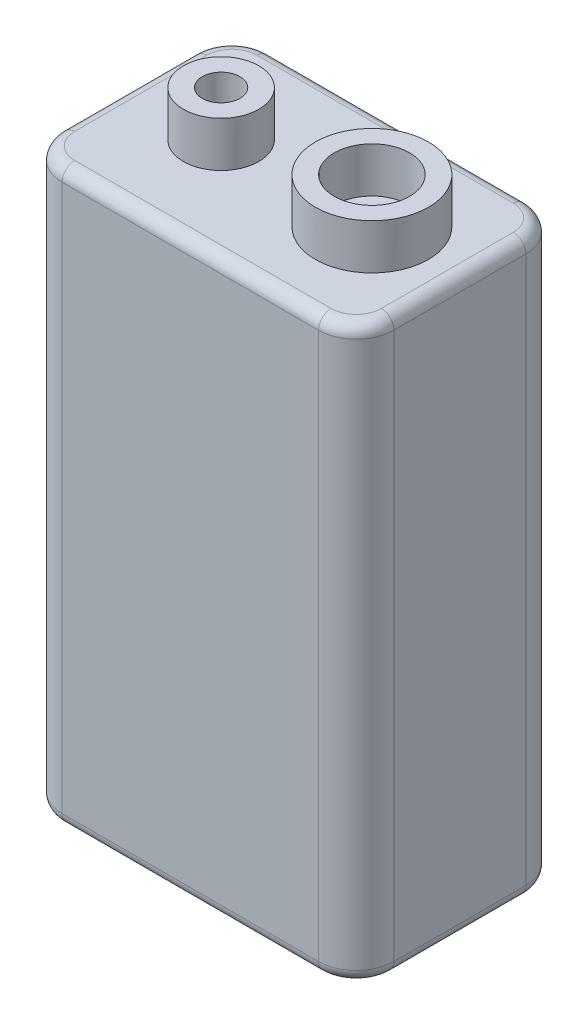
ISO-10303-21;
HEADER;
FILE_DESCRIPTION(('STEP AP214'),'2;1');
FILE_NAME('part.step','',(''),(''),'','','');
FILE_SCHEMA(('AUTOMOTIVE_DESIGN { 1 0 10303 214 1 1 1 1 }'));
ENDSEC;
DATA;
#1=APPLICATION_CONTEXT('core data for automotive mechanical design processes');
#2=APPLICATION_PROTOCOL_DEFINITION('international standard','automotive_design',2000,#1);
#3=PRODUCT_CONTEXT('',#1,'mechanical');
#4=PRODUCT('Part','Part','',(#3));
#5=PRODUCT_RELATED_PRODUCT_CATEGORY('part','',(#4));
#6=PRODUCT_DEFINITION_FORMATION('','',#4);
#7=PRODUCT_DEFINITION_CONTEXT('part definition',#1,'design');
#8=PRODUCT_DEFINITION('design','',#6,#7);
#9=PRODUCT_DEFINITION_SHAPE('','',#8);
#10=(LENGTH_UNIT() NAMED_UNIT(*) SI_UNIT(.MILLI.,.METRE.));
#11=(NAMED_UNIT(*) PLANE_ANGLE_UNIT() SI_UNIT($,.RADIAN.));
#12=(NAMED_UNIT(*) SI_UNIT($,.STERADIAN.) SOLID_ANGLE_UNIT());
#13=UNCERTAINTY_MEASURE_WITH_UNIT(LENGTH_MEASURE(1.E-05),#10,'distance_accuracy_value','');
#14=(GEOMETRIC_REPRESENTATION_CONTEXT(3) GLOBAL_UNCERTAINTY_ASSIGNED_CONTEXT((#13)) GLOBAL_UNIT_ASSIGNED_CONTEXT((#10,
#11,#12)) REPRESENTATION_CONTEXT('',''));
#15=CARTESIAN_POINT('',(0.,0.,0.));
#16=DIRECTION('',(0.,0.,1.));
#17=DIRECTION('',(1.,0.,0.));
#18=AXIS2_PLACEMENT_3D('',#15,#16,#17);
#19=CARTESIAN_POINT('',(0.,45.5,16.5));
#20=DIRECTION('',(0.,-1.,0.));
#21=DIRECTION('',(0.,0.,-1.));
#22=AXIS2_PLACEMENT_3D('',#19,#20,#21);
#23=PLANE('',#22);
#24=DIRECTION('',(-1.,0.,0.));
#25=VECTOR('',#24,1.);
#26=CARTESIAN_POINT('',(0.,45.5,15.5));
#27=LINE('',#26,#25);
#28=CARTESIAN_POINT('',(3.,45.5,15.5));
#29=VERTEX_POINT('',#28);
#30=CARTESIAN_POINT('',(23.4,45.5,15.5));
#31=VERTEX_POINT('',#30);
#32=EDGE_CURVE('E157',#29,#31,#27,.F.);
#33=ORIENTED_EDGE('',*,*,#32,.T.);
#34=CARTESIAN_POINT('',(23.4,45.5,13.5));
#35=DIRECTION('',(0.,-1.,0.));
#36=DIRECTION('',(0.,0.,-1.));
#37=AXIS2_PLACEMENT_3D('',#34,#35,#36);
#38=CIRCLE('',#37,2.);
#39=CARTESIAN_POINT('',(25.4,45.5,13.5));
#40=VERTEX_POINT('',#39);
#41=EDGE_CURVE('E194',#31,#40,#38,.F.);
#42=ORIENTED_EDGE('',*,*,#41,.T.);
#43=DIRECTION('',(0.,0.,-1.));
#44=VECTOR('',#43,1.);
#45=CARTESIAN_POINT('',(25.4,45.5,16.5));
#46=LINE('',#45,#44);
#47=CARTESIAN_POINT('',(25.4,45.5,3.));
#48=VERTEX_POINT('',#47);
#49=EDGE_CURVE('E192',#40,#48,#46,.T.);
#50=ORIENTED_EDGE('',*,*,#49,.T.);
#51=CARTESIAN_POINT('',(23.4,45.5,3.));
#52=DIRECTION('',(0.,-1.,0.));
#53=DIRECTION('',(0.,0.,-1.));
#54=AXIS2_PLACEMENT_3D('',#51,#52,#53);
#55=CIRCLE('',#54,2.);
#56=CARTESIAN_POINT('',(23.4,45.5,1.));
#57=VERTEX_POINT('',#56);
#58=EDGE_CURVE('E190',#48,#57,#55,.F.);
#59=ORIENTED_EDGE('',*,*,#58,.T.);
#60=DIRECTION('',(-1.,0.,0.));
#61=VECTOR('',#60,1.);
#62=CARTESIAN_POINT('',(3.,45.5,1.));
#63=LINE('',#62,#61);
#64=CARTESIAN_POINT('',(3.,45.5,0.999999999999999));
#65=VERTEX_POINT('',#64);
#66=EDGE_CURVE('E188',#57,#65,#63,.T.);
#67=ORIENTED_EDGE('',*,*,#66,.T.);
#68=CARTESIAN_POINT('',(3.,45.5,3.));
#69=DIRECTION('',(0.,-1.,0.));
#70=DIRECTION('',(0.,0.,-1.));
#71=AXIS2_PLACEMENT_3D('',#68,#69,#70);
#72=CIRCLE('',#71,2.);
#73=CARTESIAN_POINT('',(1.,45.5,3.));
#74=VERTEX_POINT('',#73);
#75=EDGE_CURVE('E186',#65,#74,#72,.F.);
#76=ORIENTED_EDGE('',*,*,#75,.T.);
#77=DIRECTION('',(0.,0.,-1.));
#78=VECTOR('',#77,1.);
#79=CARTESIAN_POINT('',(1.,45.5,16.5));
#80=LINE('',#79,#78);
#81=CARTESIAN_POINT('',(1.,45.5,13.5));
#82=VERTEX_POINT('',#81);
#83=EDGE_CURVE('E160',#74,#82,#80,.F.);
#84=ORIENTED_EDGE('',*,*,#83,.T.);
#85=CARTESIAN_POINT('',(3.,45.5,13.5));
#86=DIRECTION('',(0.,-1.,0.));
#87=DIRECTION('',(0.,0.,-1.));
#88=AXIS2_PLACEMENT_3D('',#85,#86,#87);
#89=CIRCLE('',#88,2.);
#90=EDGE_CURVE('E152',#82,#29,#89,.F.);
#91=ORIENTED_EDGE('',*,*,#90,.T.);
#92=EDGE_LOOP('',(#33,#42,#50,#59,#67,#76,#84,#91));
#93=FACE_BOUND('',#92,.T.);
#94=CARTESIAN_POINT('',(7.4,45.5,8.25));
#95=DIRECTION('',(0.,-1.,0.));
#96=DIRECTION('',(0.,0.,-1.));
#97=AXIS2_PLACEMENT_3D('',#94,#95,#96);
#98=CIRCLE('',#97,3.);
#99=CARTESIAN_POINT('',(7.4,45.5,5.25));
#100=VERTEX_POINT('',#99);
#101=EDGE_CURVE('E181',#100,#100,#98,.F.);
#102=ORIENTED_EDGE('',*,*,#101,.F.);
#103=EDGE_LOOP('',(#102));
#104=FACE_BOUND('',#103,.T.);
#105=CARTESIAN_POINT('',(19.4,45.5,8.25));
#106=DIRECTION('',(0.,-1.,0.));
#107=DIRECTION('',(0.,0.,-1.));
#108=AXIS2_PLACEMENT_3D('',#105,#106,#107);
#109=CIRCLE('',#108,4.5);
#110=CARTESIAN_POINT('',(19.4,45.5,3.75));
#111=VERTEX_POINT('',#110);
#112=EDGE_CURVE('E178',#111,#111,#109,.F.);
#113=ORIENTED_EDGE('',*,*,#112,.F.);
#114=EDGE_LOOP('',(#113));
#115=FACE_BOUND('',#114,.T.);
#116=ADVANCED_FACE('F39',(#93,#104,#115),#23,.F.);
#117=CARTESIAN_POINT('',(0.,0.,16.5));
#118=DIRECTION('',(1.,0.,0.));
#119=DIRECTION('',(0.,0.,-1.));
#120=AXIS2_PLACEMENT_3D('',#117,#118,#119);
#121=PLANE('',#120);
#122=DIRECTION('',(0.,-1.,0.));
#123=VECTOR('',#122,1.);
#124=CARTESIAN_POINT('',(0.,0.,13.5));
#125=LINE('',#124,#123);
#126=CARTESIAN_POINT('',(0.,1.,13.5));
#127=VERTEX_POINT('',#126);
#128=CARTESIAN_POINT('',(0.,44.5,13.5));
#129=VERTEX_POINT('',#128);
#130=EDGE_CURVE('E307',#127,#129,#125,.F.);
#131=ORIENTED_EDGE('',*,*,#130,.T.);
#132=DIRECTION('',(0.,0.,-1.));
#133=VECTOR('',#132,1.);
#134=CARTESIAN_POINT('',(0.,44.5,16.5));
#135=LINE('',#134,#133);
#136=CARTESIAN_POINT('',(0.,44.5,3.));
#137=VERTEX_POINT('',#136);
#138=EDGE_CURVE('E219',#129,#137,#135,.T.);
#139=ORIENTED_EDGE('',*,*,#138,.T.);
#140=DIRECTION('',(0.,-1.,0.));
#141=VECTOR('',#140,1.);
#142=CARTESIAN_POINT('',(0.,0.,3.));
#143=LINE('',#142,#141);
#144=CARTESIAN_POINT('',(0.,1.,3.));
#145=VERTEX_POINT('',#144);
#146=EDGE_CURVE('E302',#137,#145,#143,.T.);
#147=ORIENTED_EDGE('',*,*,#146,.T.);
#148=DIRECTION('',(0.,0.,-1.));
#149=VECTOR('',#148,1.);
#150=CARTESIAN_POINT('',(0.,1.,16.5));
#151=LINE('',#150,#149);
#152=EDGE_CURVE('E217',#145,#127,#151,.F.);
#153=ORIENTED_EDGE('',*,*,#152,.T.);
#154=EDGE_LOOP('',(#131,#139,#147,#153));
#155=FACE_BOUND('',#154,.T.);
#156=ADVANCED_FACE('F325',(#155),#121,.F.);
#157=CARTESIAN_POINT('',(0.,0.,16.5));
#158=DIRECTION('',(0.,1.,0.));
#159=DIRECTION('',(0.,0.,1.));
#160=AXIS2_PLACEMENT_3D('',#157,#158,#159);
#161=PLANE('',#160);
#162=DIRECTION('',(1.,0.,0.));
#163=VECTOR('',#162,1.);
#164=CARTESIAN_POINT('',(0.,0.,15.5));
#165=LINE('',#164,#163);
#166=CARTESIAN_POINT('',(23.4,0.,15.5));
#167=VERTEX_POINT('',#166);
#168=CARTESIAN_POINT('',(3.,0.,15.5));
#169=VERTEX_POINT('',#168);
#170=EDGE_CURVE('E56',#167,#169,#165,.F.);
#171=ORIENTED_EDGE('',*,*,#170,.T.);
#172=CARTESIAN_POINT('',(3.,0.,13.5));
#173=DIRECTION('',(0.,1.,0.));
#174=DIRECTION('',(0.,0.,1.));
#175=AXIS2_PLACEMENT_3D('',#172,#173,#174);
#176=CIRCLE('',#175,2.);
#177=CARTESIAN_POINT('',(1.,0.,13.5));
#178=VERTEX_POINT('',#177);
#179=EDGE_CURVE('E237',#169,#178,#176,.F.);
#180=ORIENTED_EDGE('',*,*,#179,.T.);
#181=DIRECTION('',(0.,0.,-1.));
#182=VECTOR('',#181,1.);
#183=CARTESIAN_POINT('',(1.,0.,16.5));
#184=LINE('',#183,#182);
#185=CARTESIAN_POINT('',(1.,0.,3.));
#186=VERTEX_POINT('',#185);
#187=EDGE_CURVE('E225',#178,#186,#184,.T.);
#188=ORIENTED_EDGE('',*,*,#187,.T.);
#189=CARTESIAN_POINT('',(3.,0.,3.));
#190=DIRECTION('',(0.,1.,0.));
#191=DIRECTION('',(0.,0.,1.));
#192=AXIS2_PLACEMENT_3D('',#189,#190,#191);
#193=CIRCLE('',#192,2.);
#194=CARTESIAN_POINT('',(3.,0.,0.999999999999999));
#195=VERTEX_POINT('',#194);
#196=EDGE_CURVE('E227',#186,#195,#193,.F.);
#197=ORIENTED_EDGE('',*,*,#196,.T.);
#198=DIRECTION('',(1.,0.,0.));
#199=VECTOR('',#198,1.);
#200=CARTESIAN_POINT('',(23.4,0.,1.));
#201=LINE('',#200,#199);
#202=CARTESIAN_POINT('',(23.4,0.,1.));
#203=VERTEX_POINT('',#202);
#204=EDGE_CURVE('E229',#195,#203,#201,.T.);
#205=ORIENTED_EDGE('',*,*,#204,.T.);
#206=CARTESIAN_POINT('',(23.4,0.,3.));
#207=DIRECTION('',(0.,1.,0.));
#208=DIRECTION('',(0.,0.,1.));
#209=AXIS2_PLACEMENT_3D('',#206,#207,#208);
#210=CIRCLE('',#209,2.);
#211=CARTESIAN_POINT('',(25.4,0.,3.));
#212=VERTEX_POINT('',#211);
#213=EDGE_CURVE('E231',#203,#212,#210,.F.);
#214=ORIENTED_EDGE('',*,*,#213,.T.);
#215=DIRECTION('',(0.,0.,-1.));
#216=VECTOR('',#215,1.);
#217=CARTESIAN_POINT('',(25.4,0.,16.5));
#218=LINE('',#217,#216);
#219=CARTESIAN_POINT('',(25.4,0.,13.5));
#220=VERTEX_POINT('',#219);
#221=EDGE_CURVE('E233',#212,#220,#218,.F.);
#222=ORIENTED_EDGE('',*,*,#221,.T.);
#223=CARTESIAN_POINT('',(23.4,0.,13.5));
#224=DIRECTION('',(0.,1.,0.));
#225=DIRECTION('',(0.,0.,1.));
#226=AXIS2_PLACEMENT_3D('',#223,#224,#225);
#227=CIRCLE('',#226,2.);
#228=EDGE_CURVE('E61',#220,#167,#227,.F.);
#229=ORIENTED_EDGE('',*,*,#228,.T.);
#230=EDGE_LOOP('',(#171,#180,#188,#197,#205,#214,#222,#229));
#231=FACE_BOUND('',#230,.T.);
#232=ADVANCED_FACE('F371',(#231),#161,.F.);
#233=CARTESIAN_POINT('',(26.4,0.,16.5));
#234=DIRECTION('',(-1.,0.,0.));
#235=DIRECTION('',(0.,0.,1.));
#236=AXIS2_PLACEMENT_3D('',#233,#234,#235);
#237=PLANE('',#236);
#238=DIRECTION('',(0.,1.,0.));
#239=VECTOR('',#238,1.);
#240=CARTESIAN_POINT('',(26.4,45.5,3.));
#241=LINE('',#240,#239);
#242=CARTESIAN_POINT('',(26.4,1.,3.));
#243=VERTEX_POINT('',#242);
#244=CARTESIAN_POINT('',(26.4,44.5,3.));
#245=VERTEX_POINT('',#244);
#246=EDGE_CURVE('E295',#243,#245,#241,.T.);
#247=ORIENTED_EDGE('',*,*,#246,.T.);
#248=DIRECTION('',(0.,0.,-1.));
#249=VECTOR('',#248,1.);
#250=CARTESIAN_POINT('',(26.4,44.5,16.5));
#251=LINE('',#250,#249);
#252=CARTESIAN_POINT('',(26.4,44.5,13.5));
#253=VERTEX_POINT('',#252);
#254=EDGE_CURVE('E203',#245,#253,#251,.F.);
#255=ORIENTED_EDGE('',*,*,#254,.T.);
#256=DIRECTION('',(0.,1.,0.));
#257=VECTOR('',#256,1.);
#258=CARTESIAN_POINT('',(26.4,0.,13.5));
#259=LINE('',#258,#257);
#260=CARTESIAN_POINT('',(26.4,1.,13.5));
#261=VERTEX_POINT('',#260);
#262=EDGE_CURVE('E316',#253,#261,#259,.F.);
#263=ORIENTED_EDGE('',*,*,#262,.T.);
#264=DIRECTION('',(0.,0.,-1.));
#265=VECTOR('',#264,1.);
#266=CARTESIAN_POINT('',(26.4,1.,16.5));
#267=LINE('',#266,#265);
#268=EDGE_CURVE('E201',#261,#243,#267,.T.);
#269=ORIENTED_EDGE('',*,*,#268,.T.);
#270=EDGE_LOOP('',(#247,#255,#263,#269));
#271=FACE_BOUND('',#270,.T.);
#272=ADVANCED_FACE('F362',(#271),#237,.F.);
#273=CARTESIAN_POINT('',(0.,0.,16.5));
#274=DIRECTION('',(0.,0.,-1.));
#275=DIRECTION('',(-1.,0.,0.));
#276=AXIS2_PLACEMENT_3D('',#273,#274,#275);
#277=PLANE('',#276);
#278=DIRECTION('',(0.,-1.,0.));
#279=VECTOR('',#278,1.);
#280=CARTESIAN_POINT('',(3.,0.,16.5));
#281=LINE('',#280,#279);
#282=CARTESIAN_POINT('',(3.,44.5,16.5));
#283=VERTEX_POINT('',#282);
#284=CARTESIAN_POINT('',(3.,1.,16.5));
#285=VERTEX_POINT('',#284);
#286=EDGE_CURVE('E313',#283,#285,#281,.T.);
#287=ORIENTED_EDGE('',*,*,#286,.T.);
#288=DIRECTION('',(1.,0.,0.));
#289=VECTOR('',#288,1.);
#290=CARTESIAN_POINT('',(0.,1.,16.5));
#291=LINE('',#290,#289);
#292=CARTESIAN_POINT('',(23.4,1.,16.5));
#293=VERTEX_POINT('',#292);
#294=EDGE_CURVE('E11',#285,#293,#291,.T.);
#295=ORIENTED_EDGE('',*,*,#294,.T.);
#296=DIRECTION('',(0.,1.,0.));
#297=VECTOR('',#296,1.);
#298=CARTESIAN_POINT('',(23.4,0.,16.5));
#299=LINE('',#298,#297);
#300=CARTESIAN_POINT('',(23.4,44.5,16.5));
#301=VERTEX_POINT('',#300);
#302=EDGE_CURVE('E304',#293,#301,#299,.T.);
#303=ORIENTED_EDGE('',*,*,#302,.T.);
#304=DIRECTION('',(-1.,0.,0.));
#305=VECTOR('',#304,1.);
#306=CARTESIAN_POINT('',(0.,44.5,16.5));
#307=LINE('',#306,#305);
#308=EDGE_CURVE('E48',#301,#283,#307,.T.);
#309=ORIENTED_EDGE('',*,*,#308,.T.);
#310=EDGE_LOOP('',(#287,#295,#303,#309));
#311=FACE_BOUND('',#310,.T.);
#312=ADVANCED_FACE('F359',(#311),#277,.F.);
#313=CARTESIAN_POINT('',(0.,0.,0.));
#314=DIRECTION('',(0.,0.,-1.));
#315=DIRECTION('',(-1.,0.,0.));
#316=AXIS2_PLACEMENT_3D('',#313,#314,#315);
#317=PLANE('',#316);
#318=DIRECTION('',(0.,-1.,0.));
#319=VECTOR('',#318,1.);
#320=CARTESIAN_POINT('',(3.,45.5,0.));
#321=LINE('',#320,#319);
#322=CARTESIAN_POINT('',(3.,1.,0.));
#323=VERTEX_POINT('',#322);
#324=CARTESIAN_POINT('',(3.,44.5,0.));
#325=VERTEX_POINT('',#324);
#326=EDGE_CURVE('E301',#323,#325,#321,.F.);
#327=ORIENTED_EDGE('',*,*,#326,.T.);
#328=DIRECTION('',(-1.,0.,0.));
#329=VECTOR('',#328,1.);
#330=CARTESIAN_POINT('',(23.4,44.5,0.));
#331=LINE('',#330,#329);
#332=CARTESIAN_POINT('',(23.4,44.5,0.));
#333=VERTEX_POINT('',#332);
#334=EDGE_CURVE('E211',#325,#333,#331,.F.);
#335=ORIENTED_EDGE('',*,*,#334,.T.);
#336=DIRECTION('',(0.,1.,0.));
#337=VECTOR('',#336,1.);
#338=CARTESIAN_POINT('',(23.4,0.,0.));
#339=LINE('',#338,#337);
#340=CARTESIAN_POINT('',(23.4,1.,0.));
#341=VERTEX_POINT('',#340);
#342=EDGE_CURVE('E292',#333,#341,#339,.F.);
#343=ORIENTED_EDGE('',*,*,#342,.T.);
#344=DIRECTION('',(1.,0.,0.));
#345=VECTOR('',#344,1.);
#346=CARTESIAN_POINT('',(3.,1.,0.));
#347=LINE('',#346,#345);
#348=EDGE_CURVE('E209',#341,#323,#347,.F.);
#349=ORIENTED_EDGE('',*,*,#348,.T.);
#350=EDGE_LOOP('',(#327,#335,#343,#349));
#351=FACE_BOUND('',#350,.T.);
#352=ADVANCED_FACE('F298',(#351),#317,.T.);
#353=CARTESIAN_POINT('',(3.,0.,3.));
#354=DIRECTION('',(0.,1.,0.));
#355=DIRECTION('',(0.,0.,1.));
#356=AXIS2_PLACEMENT_3D('',#353,#354,#355);
#357=CYLINDRICAL_SURFACE('',#356,3.);
#358=ORIENTED_EDGE('',*,*,#146,.F.);
#359=CARTESIAN_POINT('',(3.,44.5,3.));
#360=DIRECTION('',(0.,-1.,0.));
#361=DIRECTION('',(0.,0.,-1.));
#362=AXIS2_PLACEMENT_3D('',#359,#360,#361);
#363=CIRCLE('',#362,3.);
#364=EDGE_CURVE('E215',#137,#325,#363,.T.);
#365=ORIENTED_EDGE('',*,*,#364,.T.);
#366=ORIENTED_EDGE('',*,*,#326,.F.);
#367=CARTESIAN_POINT('',(3.,1.,3.));
#368=DIRECTION('',(0.,1.,0.));
#369=DIRECTION('',(0.,0.,1.));
#370=AXIS2_PLACEMENT_3D('',#367,#368,#369);
#371=CIRCLE('',#370,3.);
#372=EDGE_CURVE('E213',#323,#145,#371,.T.);
#373=ORIENTED_EDGE('',*,*,#372,.T.);
#374=EDGE_LOOP('',(#358,#365,#366,#373));
#375=FACE_BOUND('',#374,.T.);
#376=ADVANCED_FACE('F365',(#375),#357,.T.);
#377=CARTESIAN_POINT('',(3.,0.,13.5));
#378=DIRECTION('',(0.,-1.,0.));
#379=DIRECTION('',(0.,0.,-1.));
#380=AXIS2_PLACEMENT_3D('',#377,#378,#379);
#381=CYLINDRICAL_SURFACE('',#380,3.);
#382=ORIENTED_EDGE('',*,*,#286,.F.);
#383=CARTESIAN_POINT('',(3.,44.5,13.5));
#384=DIRECTION('',(0.,-1.,0.));
#385=DIRECTION('',(0.,0.,-1.));
#386=AXIS2_PLACEMENT_3D('',#383,#384,#385);
#387=CIRCLE('',#386,3.);
#388=EDGE_CURVE('E169',#283,#129,#387,.T.);
#389=ORIENTED_EDGE('',*,*,#388,.T.);
#390=ORIENTED_EDGE('',*,*,#130,.F.);
#391=CARTESIAN_POINT('',(3.,1.,13.5));
#392=DIRECTION('',(0.,1.,0.));
#393=DIRECTION('',(0.,0.,1.));
#394=AXIS2_PLACEMENT_3D('',#391,#392,#393);
#395=CIRCLE('',#394,3.);
#396=EDGE_CURVE('E221',#127,#285,#395,.T.);
#397=ORIENTED_EDGE('',*,*,#396,.T.);
#398=EDGE_LOOP('',(#382,#389,#390,#397));
#399=FACE_BOUND('',#398,.T.);
#400=ADVANCED_FACE('F380',(#399),#381,.T.);
#401=CARTESIAN_POINT('',(23.4,0.,3.));
#402=DIRECTION('',(0.,-1.,0.));
#403=DIRECTION('',(0.,0.,-1.));
#404=AXIS2_PLACEMENT_3D('',#401,#402,#403);
#405=CYLINDRICAL_SURFACE('',#404,3.);
#406=ORIENTED_EDGE('',*,*,#342,.F.);
#407=CARTESIAN_POINT('',(23.4,44.5,3.));
#408=DIRECTION('',(0.,-1.,0.));
#409=DIRECTION('',(0.,0.,-1.));
#410=AXIS2_PLACEMENT_3D('',#407,#408,#409);
#411=CIRCLE('',#410,3.);
#412=EDGE_CURVE('E207',#333,#245,#411,.T.);
#413=ORIENTED_EDGE('',*,*,#412,.T.);
#414=ORIENTED_EDGE('',*,*,#246,.F.);
#415=CARTESIAN_POINT('',(23.4,1.,3.));
#416=DIRECTION('',(0.,1.,0.));
#417=DIRECTION('',(0.,0.,1.));
#418=AXIS2_PLACEMENT_3D('',#415,#416,#417);
#419=CIRCLE('',#418,3.);
#420=EDGE_CURVE('E205',#243,#341,#419,.T.);
#421=ORIENTED_EDGE('',*,*,#420,.T.);
#422=EDGE_LOOP('',(#406,#413,#414,#421));
#423=FACE_BOUND('',#422,.T.);
#424=ADVANCED_FACE('F291',(#423),#405,.T.);
#425=CARTESIAN_POINT('',(23.4,0.,13.5));
#426=DIRECTION('',(0.,1.,0.));
#427=DIRECTION('',(0.,0.,1.));
#428=AXIS2_PLACEMENT_3D('',#425,#426,#427);
#429=CYLINDRICAL_SURFACE('',#428,3.);
#430=ORIENTED_EDGE('',*,*,#262,.F.);
#431=CARTESIAN_POINT('',(23.4,44.5,13.5));
#432=DIRECTION('',(0.,-1.,0.));
#433=DIRECTION('',(0.,0.,-1.));
#434=AXIS2_PLACEMENT_3D('',#431,#432,#433);
#435=CIRCLE('',#434,3.);
#436=EDGE_CURVE('E198',#253,#301,#435,.T.);
#437=ORIENTED_EDGE('',*,*,#436,.T.);
#438=ORIENTED_EDGE('',*,*,#302,.F.);
#439=CARTESIAN_POINT('',(23.4,1.,13.5));
#440=DIRECTION('',(0.,1.,0.));
#441=DIRECTION('',(0.,0.,1.));
#442=AXIS2_PLACEMENT_3D('',#439,#440,#441);
#443=CIRCLE('',#442,3.);
#444=EDGE_CURVE('E196',#293,#261,#443,.T.);
#445=ORIENTED_EDGE('',*,*,#444,.T.);
#446=EDGE_LOOP('',(#430,#437,#438,#445));
#447=FACE_BOUND('',#446,.T.);
#448=ADVANCED_FACE('F354',(#447),#429,.T.);
#449=CARTESIAN_POINT('',(7.4,49.1,8.25));
#450=DIRECTION('',(0.,1.,0.));
#451=DIRECTION('',(0.,0.,1.));
#452=AXIS2_PLACEMENT_3D('',#449,#450,#451);
#453=PLANE('',#452);
#454=CARTESIAN_POINT('',(7.4,49.1,8.25));
#455=DIRECTION('',(0.,1.,0.));
#456=DIRECTION('',(0.,0.,1.));
#457=AXIS2_PLACEMENT_3D('',#454,#455,#456);
#458=CIRCLE('',#457,3.);
#459=CARTESIAN_POINT('',(7.4,49.1,11.25));
#460=VERTEX_POINT('',#459);
#461=EDGE_CURVE('E677',#460,#460,#458,.T.);
#462=ORIENTED_EDGE('',*,*,#461,.T.);
#463=EDGE_LOOP('',(#462));
#464=FACE_BOUND('',#463,.T.);
#465=CARTESIAN_POINT('',(7.4,49.1,8.25));
#466=DIRECTION('',(0.,1.,0.));
#467=DIRECTION('',(0.,0.,1.));
#468=AXIS2_PLACEMENT_3D('',#465,#466,#467);
#469=CIRCLE('',#468,1.5);
#470=CARTESIAN_POINT('',(7.4,49.1,9.75));
#471=VERTEX_POINT('',#470);
#472=EDGE_CURVE('E674',#471,#471,#469,.T.);
#473=ORIENTED_EDGE('',*,*,#472,.F.);
#474=EDGE_LOOP('',(#473));
#475=FACE_BOUND('',#474,.T.);
#476=ADVANCED_FACE('F351',(#464,#475),#453,.T.);
#477=CARTESIAN_POINT('',(7.4,49.1,8.25));
#478=DIRECTION('',(0.,-1.,0.));
#479=DIRECTION('',(0.,0.,-1.));
#480=AXIS2_PLACEMENT_3D('',#477,#478,#479);
#481=CYLINDRICAL_SURFACE('',#480,3.);
#482=ORIENTED_EDGE('',*,*,#461,.F.);
#483=EDGE_LOOP('',(#482));
#484=FACE_BOUND('',#483,.T.);
#485=ORIENTED_EDGE('',*,*,#101,.T.);
#486=EDGE_LOOP('',(#485));
#487=FACE_BOUND('',#486,.T.);
#488=ADVANCED_FACE('F322',(#484,#487),#481,.T.);
#489=CARTESIAN_POINT('',(7.4,49.1,8.25));
#490=DIRECTION('',(0.,-1.,0.));
#491=DIRECTION('',(0.,0.,-1.));
#492=AXIS2_PLACEMENT_3D('',#489,#490,#491);
#493=CYLINDRICAL_SURFACE('',#492,1.5);
#494=ORIENTED_EDGE('',*,*,#472,.T.);
#495=EDGE_LOOP('',(#494));
#496=FACE_BOUND('',#495,.T.);
#497=CARTESIAN_POINT('',(7.4,45.5,8.25));
#498=DIRECTION('',(0.,1.,0.));
#499=DIRECTION('',(0.,0.,1.));
#500=AXIS2_PLACEMENT_3D('',#497,#498,#499);
#501=CIRCLE('',#500,1.5);
#502=CARTESIAN_POINT('',(7.4,45.5,9.75));
#503=VERTEX_POINT('',#502);
#504=EDGE_CURVE('E673',#503,#503,#501,.T.);
#505=ORIENTED_EDGE('',*,*,#504,.F.);
#506=EDGE_LOOP('',(#505));
#507=FACE_BOUND('',#506,.T.);
#508=ADVANCED_FACE('F347',(#496,#507),#493,.F.);
#509=ORIENTED_EDGE('',*,*,#504,.T.);
#510=EDGE_LOOP('',(#509));
#511=FACE_BOUND('',#510,.T.);
#512=ADVANCED_FACE('F328',(#511),#23,.F.);
#513=CARTESIAN_POINT('',(19.4,49.1,8.25));
#514=DIRECTION('',(0.,1.,0.));
#515=DIRECTION('',(0.,0.,1.));
#516=AXIS2_PLACEMENT_3D('',#513,#514,#515);
#517=PLANE('',#516);
#518=CARTESIAN_POINT('',(19.4,49.1,8.25));
#519=DIRECTION('',(0.,1.,0.));
#520=DIRECTION('',(0.,0.,1.));
#521=AXIS2_PLACEMENT_3D('',#518,#519,#520);
#522=CIRCLE('',#521,4.5);
#523=CARTESIAN_POINT('',(19.4,49.1,12.75));
#524=VERTEX_POINT('',#523);
#525=EDGE_CURVE('E668',#524,#524,#522,.T.);
#526=ORIENTED_EDGE('',*,*,#525,.T.);
#527=EDGE_LOOP('',(#526));
#528=FACE_BOUND('',#527,.T.);
#529=CARTESIAN_POINT('',(19.4,49.1,8.25));
#530=DIRECTION('',(0.,1.,0.));
#531=DIRECTION('',(0.,0.,1.));
#532=AXIS2_PLACEMENT_3D('',#529,#530,#531);
#533=CIRCLE('',#532,3.);
#534=CARTESIAN_POINT('',(19.4,49.1,11.25));
#535=VERTEX_POINT('',#534);
#536=EDGE_CURVE('E665',#535,#535,#533,.T.);
#537=ORIENTED_EDGE('',*,*,#536,.F.);
#538=EDGE_LOOP('',(#537));
#539=FACE_BOUND('',#538,.T.);
#540=ADVANCED_FACE('F334',(#528,#539),#517,.T.);
#541=CARTESIAN_POINT('',(19.4,49.1,8.25));
#542=DIRECTION('',(0.,-1.,0.));
#543=DIRECTION('',(0.,0.,-1.));
#544=AXIS2_PLACEMENT_3D('',#541,#542,#543);
#545=CYLINDRICAL_SURFACE('',#544,4.5);
#546=ORIENTED_EDGE('',*,*,#525,.F.);
#547=EDGE_LOOP('',(#546));
#548=FACE_BOUND('',#547,.T.);
#549=ORIENTED_EDGE('',*,*,#112,.T.);
#550=EDGE_LOOP('',(#549));
#551=FACE_BOUND('',#550,.T.);
#552=ADVANCED_FACE('F331',(#548,#551),#545,.T.);
#553=CARTESIAN_POINT('',(19.4,49.1,8.25));
#554=DIRECTION('',(0.,-1.,0.));
#555=DIRECTION('',(0.,0.,-1.));
#556=AXIS2_PLACEMENT_3D('',#553,#554,#555);
#557=CYLINDRICAL_SURFACE('',#556,3.);
#558=ORIENTED_EDGE('',*,*,#536,.T.);
#559=EDGE_LOOP('',(#558));
#560=FACE_BOUND('',#559,.T.);
#561=CARTESIAN_POINT('',(19.4,45.5,8.25));
#562=DIRECTION('',(0.,1.,0.));
#563=DIRECTION('',(0.,0.,1.));
#564=AXIS2_PLACEMENT_3D('',#561,#562,#563);
#565=CIRCLE('',#564,3.);
#566=CARTESIAN_POINT('',(19.4,45.5,11.25));
#567=VERTEX_POINT('',#566);
#568=EDGE_CURVE('E255',#567,#567,#565,.T.);
#569=ORIENTED_EDGE('',*,*,#568,.F.);
#570=EDGE_LOOP('',(#569));
#571=FACE_BOUND('',#570,.T.);
#572=ADVANCED_FACE('F333',(#560,#571),#557,.F.);
#573=ORIENTED_EDGE('',*,*,#568,.T.);
#574=EDGE_LOOP('',(#573));
#575=FACE_BOUND('',#574,.T.);
#576=ADVANCED_FACE('F327',(#575),#23,.F.);
#577=CARTESIAN_POINT('',(3.,44.5,3.));
#578=DIRECTION('',(0.,-1.,0.));
#579=DIRECTION('',(0.,0.,-1.));
#580=AXIS2_PLACEMENT_3D('',#577,#578,#579);
#581=TOROIDAL_SURFACE('',#580,2.,1.);
#582=CARTESIAN_POINT('',(3.,44.5,0.999999999999999));
#583=DIRECTION('',(1.,0.,0.));
#584=DIRECTION('',(0.,0.,-1.));
#585=AXIS2_PLACEMENT_3D('',#582,#583,#584);
#586=CIRCLE('',#585,1.);
#587=EDGE_CURVE('E249',#325,#65,#586,.T.);
#588=ORIENTED_EDGE('',*,*,#587,.F.);
#589=ORIENTED_EDGE('',*,*,#364,.F.);
#590=CARTESIAN_POINT('',(1.,44.5,3.));
#591=DIRECTION('',(0.,0.,1.));
#592=DIRECTION('',(1.,0.,0.));
#593=AXIS2_PLACEMENT_3D('',#590,#591,#592);
#594=CIRCLE('',#593,1.);
#595=EDGE_CURVE('E252',#74,#137,#594,.T.);
#596=ORIENTED_EDGE('',*,*,#595,.F.);
#597=ORIENTED_EDGE('',*,*,#75,.F.);
#598=EDGE_LOOP('',(#588,#589,#596,#597));
#599=FACE_BOUND('',#598,.T.);
#600=ADVANCED_FACE('F413',(#599),#581,.T.);
#601=CARTESIAN_POINT('',(1.,44.5,16.5));
#602=DIRECTION('',(0.,0.,-1.));
#603=DIRECTION('',(-1.,0.,0.));
#604=AXIS2_PLACEMENT_3D('',#601,#602,#603);
#605=CYLINDRICAL_SURFACE('',#604,1.);
#606=ORIENTED_EDGE('',*,*,#595,.T.);
#607=ORIENTED_EDGE('',*,*,#138,.F.);
#608=CARTESIAN_POINT('',(1.,44.5,13.5));
#609=DIRECTION('',(0.,0.,1.));
#610=DIRECTION('',(1.,0.,0.));
#611=AXIS2_PLACEMENT_3D('',#608,#609,#610);
#612=CIRCLE('',#611,1.);
#613=EDGE_CURVE('E247',#82,#129,#612,.T.);
#614=ORIENTED_EDGE('',*,*,#613,.F.);
#615=ORIENTED_EDGE('',*,*,#83,.F.);
#616=EDGE_LOOP('',(#606,#607,#614,#615));
#617=FACE_BOUND('',#616,.T.);
#618=ADVANCED_FACE('F409',(#617),#605,.T.);
#619=CARTESIAN_POINT('',(0.,44.5,1.));
#620=DIRECTION('',(1.,0.,0.));
#621=DIRECTION('',(0.,0.,-1.));
#622=AXIS2_PLACEMENT_3D('',#619,#620,#621);
#623=CYLINDRICAL_SURFACE('',#622,1.);
#624=ORIENTED_EDGE('',*,*,#587,.T.);
#625=ORIENTED_EDGE('',*,*,#66,.F.);
#626=CARTESIAN_POINT('',(23.4,44.5,1.));
#627=DIRECTION('',(1.,0.,0.));
#628=DIRECTION('',(0.,0.,-1.));
#629=AXIS2_PLACEMENT_3D('',#626,#627,#628);
#630=CIRCLE('',#629,1.);
#631=EDGE_CURVE('E172',#333,#57,#630,.T.);
#632=ORIENTED_EDGE('',*,*,#631,.F.);
#633=ORIENTED_EDGE('',*,*,#334,.F.);
#634=EDGE_LOOP('',(#624,#625,#632,#633));
#635=FACE_BOUND('',#634,.T.);
#636=ADVANCED_FACE('F406',(#635),#623,.T.);
#637=CARTESIAN_POINT('',(3.,44.5,13.5));
#638=DIRECTION('',(0.,-1.,0.));
#639=DIRECTION('',(0.,0.,-1.));
#640=AXIS2_PLACEMENT_3D('',#637,#638,#639);
#641=TOROIDAL_SURFACE('',#640,2.,1.);
#642=ORIENTED_EDGE('',*,*,#613,.T.);
#643=ORIENTED_EDGE('',*,*,#388,.F.);
#644=CARTESIAN_POINT('',(3.,44.5,15.5));
#645=DIRECTION('',(1.,0.,0.));
#646=DIRECTION('',(0.,0.,-1.));
#647=AXIS2_PLACEMENT_3D('',#644,#645,#646);
#648=CIRCLE('',#647,1.);
#649=EDGE_CURVE('E167',#29,#283,#648,.T.);
#650=ORIENTED_EDGE('',*,*,#649,.F.);
#651=ORIENTED_EDGE('',*,*,#90,.F.);
#652=EDGE_LOOP('',(#642,#643,#650,#651));
#653=FACE_BOUND('',#652,.T.);
#654=ADVANCED_FACE('F168',(#653),#641,.T.);
#655=CARTESIAN_POINT('',(23.4,44.5,3.));
#656=DIRECTION('',(0.,-1.,0.));
#657=DIRECTION('',(0.,0.,-1.));
#658=AXIS2_PLACEMENT_3D('',#655,#656,#657);
#659=TOROIDAL_SURFACE('',#658,2.,1.);
#660=ORIENTED_EDGE('',*,*,#631,.T.);
#661=ORIENTED_EDGE('',*,*,#58,.F.);
#662=CARTESIAN_POINT('',(25.4,44.5,3.));
#663=DIRECTION('',(0.,0.,1.));
#664=DIRECTION('',(1.,0.,0.));
#665=AXIS2_PLACEMENT_3D('',#662,#663,#664);
#666=CIRCLE('',#665,1.);
#667=EDGE_CURVE('E173',#245,#48,#666,.T.);
#668=ORIENTED_EDGE('',*,*,#667,.F.);
#669=ORIENTED_EDGE('',*,*,#412,.F.);
#670=EDGE_LOOP('',(#660,#661,#668,#669));
#671=FACE_BOUND('',#670,.T.);
#672=ADVANCED_FACE('F400',(#671),#659,.T.);
#673=CARTESIAN_POINT('',(0.,44.5,15.5));
#674=DIRECTION('',(-1.,0.,0.));
#675=DIRECTION('',(0.,0.,1.));
#676=AXIS2_PLACEMENT_3D('',#673,#674,#675);
#677=CYLINDRICAL_SURFACE('',#676,1.);
#678=ORIENTED_EDGE('',*,*,#649,.T.);
#679=ORIENTED_EDGE('',*,*,#308,.F.);
#680=CARTESIAN_POINT('',(23.4,44.5,15.5));
#681=DIRECTION('',(1.,0.,0.));
#682=DIRECTION('',(0.,0.,-1.));
#683=AXIS2_PLACEMENT_3D('',#680,#681,#682);
#684=CIRCLE('',#683,1.);
#685=EDGE_CURVE('E176',#31,#301,#684,.T.);
#686=ORIENTED_EDGE('',*,*,#685,.F.);
#687=ORIENTED_EDGE('',*,*,#32,.F.);
#688=EDGE_LOOP('',(#678,#679,#686,#687));
#689=FACE_BOUND('',#688,.T.);
#690=ADVANCED_FACE('F175',(#689),#677,.T.);
#691=CARTESIAN_POINT('',(25.4,44.5,16.5));
#692=DIRECTION('',(0.,0.,-1.));
#693=DIRECTION('',(-1.,0.,0.));
#694=AXIS2_PLACEMENT_3D('',#691,#692,#693);
#695=CYLINDRICAL_SURFACE('',#694,1.);
#696=ORIENTED_EDGE('',*,*,#667,.T.);
#697=ORIENTED_EDGE('',*,*,#49,.F.);
#698=CARTESIAN_POINT('',(25.4,44.5,13.5));
#699=DIRECTION('',(0.,0.,1.));
#700=DIRECTION('',(1.,0.,0.));
#701=AXIS2_PLACEMENT_3D('',#698,#699,#700);
#702=CIRCLE('',#701,1.);
#703=EDGE_CURVE('E240',#253,#40,#702,.T.);
#704=ORIENTED_EDGE('',*,*,#703,.F.);
#705=ORIENTED_EDGE('',*,*,#254,.F.);
#706=EDGE_LOOP('',(#696,#697,#704,#705));
#707=FACE_BOUND('',#706,.T.);
#708=ADVANCED_FACE('F393',(#707),#695,.T.);
#709=CARTESIAN_POINT('',(23.4,44.5,13.5));
#710=DIRECTION('',(0.,-1.,0.));
#711=DIRECTION('',(0.,0.,-1.));
#712=AXIS2_PLACEMENT_3D('',#709,#710,#711);
#713=TOROIDAL_SURFACE('',#712,2.,1.);
#714=ORIENTED_EDGE('',*,*,#685,.T.);
#715=ORIENTED_EDGE('',*,*,#436,.F.);
#716=ORIENTED_EDGE('',*,*,#703,.T.);
#717=ORIENTED_EDGE('',*,*,#41,.F.);
#718=EDGE_LOOP('',(#714,#715,#716,#717));
#719=FACE_BOUND('',#718,.T.);
#720=ADVANCED_FACE('F390',(#719),#713,.T.);
#721=CARTESIAN_POINT('',(23.4,1.,3.));
#722=DIRECTION('',(0.,1.,0.));
#723=DIRECTION('',(0.,0.,1.));
#724=AXIS2_PLACEMENT_3D('',#721,#722,#723);
#725=TOROIDAL_SURFACE('',#724,2.,1.);
#726=CARTESIAN_POINT('',(23.4,1.,0.999999999999999));
#727=DIRECTION('',(-1.,0.,0.));
#728=DIRECTION('',(0.,0.,1.));
#729=AXIS2_PLACEMENT_3D('',#726,#727,#728);
#730=CIRCLE('',#729,1.);
#731=EDGE_CURVE('E271',#341,#203,#730,.T.);
#732=ORIENTED_EDGE('',*,*,#731,.F.);
#733=ORIENTED_EDGE('',*,*,#420,.F.);
#734=CARTESIAN_POINT('',(25.4,1.,3.));
#735=DIRECTION('',(0.,0.,1.));
#736=DIRECTION('',(1.,0.,0.));
#737=AXIS2_PLACEMENT_3D('',#734,#735,#736);
#738=CIRCLE('',#737,1.);
#739=EDGE_CURVE('E43',#212,#243,#738,.T.);
#740=ORIENTED_EDGE('',*,*,#739,.F.);
#741=ORIENTED_EDGE('',*,*,#213,.F.);
#742=EDGE_LOOP('',(#732,#733,#740,#741));
#743=FACE_BOUND('',#742,.T.);
#744=ADVANCED_FACE('F41',(#743),#725,.T.);
#745=CARTESIAN_POINT('',(25.4,1.,16.5));
#746=DIRECTION('',(0.,0.,-1.));
#747=DIRECTION('',(-1.,0.,0.));
#748=AXIS2_PLACEMENT_3D('',#745,#746,#747);
#749=CYLINDRICAL_SURFACE('',#748,1.);
#750=ORIENTED_EDGE('',*,*,#739,.T.);
#751=ORIENTED_EDGE('',*,*,#268,.F.);
#752=CARTESIAN_POINT('',(25.4,1.,13.5));
#753=DIRECTION('',(0.,0.,1.));
#754=DIRECTION('',(1.,0.,0.));
#755=AXIS2_PLACEMENT_3D('',#752,#753,#754);
#756=CIRCLE('',#755,1.);
#757=EDGE_CURVE('E269',#220,#261,#756,.T.);
#758=ORIENTED_EDGE('',*,*,#757,.F.);
#759=ORIENTED_EDGE('',*,*,#221,.F.);
#760=EDGE_LOOP('',(#750,#751,#758,#759));
#761=FACE_BOUND('',#760,.T.);
#762=ADVANCED_FACE('F282',(#761),#749,.T.);
#763=CARTESIAN_POINT('',(0.,1.,1.));
#764=DIRECTION('',(-1.,0.,0.));
#765=DIRECTION('',(0.,0.,1.));
#766=AXIS2_PLACEMENT_3D('',#763,#764,#765);
#767=CYLINDRICAL_SURFACE('',#766,1.);
#768=ORIENTED_EDGE('',*,*,#731,.T.);
#769=ORIENTED_EDGE('',*,*,#204,.F.);
#770=CARTESIAN_POINT('',(3.,1.,1.));
#771=DIRECTION('',(-1.,0.,0.));
#772=DIRECTION('',(0.,0.,1.));
#773=AXIS2_PLACEMENT_3D('',#770,#771,#772);
#774=CIRCLE('',#773,1.);
#775=EDGE_CURVE('E266',#323,#195,#774,.T.);
#776=ORIENTED_EDGE('',*,*,#775,.F.);
#777=ORIENTED_EDGE('',*,*,#348,.F.);
#778=EDGE_LOOP('',(#768,#769,#776,#777));
#779=FACE_BOUND('',#778,.T.);
#780=ADVANCED_FACE('F437',(#779),#767,.T.);
#781=CARTESIAN_POINT('',(23.4,1.,13.5));
#782=DIRECTION('',(0.,1.,0.));
#783=DIRECTION('',(0.,0.,1.));
#784=AXIS2_PLACEMENT_3D('',#781,#782,#783);
#785=TOROIDAL_SURFACE('',#784,2.,1.);
#786=ORIENTED_EDGE('',*,*,#757,.T.);
#787=ORIENTED_EDGE('',*,*,#444,.F.);
#788=CARTESIAN_POINT('',(23.4,1.,15.5));
#789=DIRECTION('',(-1.,0.,0.));
#790=DIRECTION('',(0.,0.,1.));
#791=AXIS2_PLACEMENT_3D('',#788,#789,#790);
#792=CIRCLE('',#791,1.);
#793=EDGE_CURVE('E263',#167,#293,#792,.T.);
#794=ORIENTED_EDGE('',*,*,#793,.F.);
#795=ORIENTED_EDGE('',*,*,#228,.F.);
#796=EDGE_LOOP('',(#786,#787,#794,#795));
#797=FACE_BOUND('',#796,.T.);
#798=ADVANCED_FACE('F433',(#797),#785,.T.);
#799=CARTESIAN_POINT('',(3.,1.,3.));
#800=DIRECTION('',(0.,1.,0.));
#801=DIRECTION('',(0.,0.,1.));
#802=AXIS2_PLACEMENT_3D('',#799,#800,#801);
#803=TOROIDAL_SURFACE('',#802,2.,1.);
#804=ORIENTED_EDGE('',*,*,#775,.T.);
#805=ORIENTED_EDGE('',*,*,#196,.F.);
#806=CARTESIAN_POINT('',(1.,1.,3.));
#807=DIRECTION('',(0.,0.,1.));
#808=DIRECTION('',(1.,0.,0.));
#809=AXIS2_PLACEMENT_3D('',#806,#807,#808);
#810=CIRCLE('',#809,1.);
#811=EDGE_CURVE('E260',#145,#186,#810,.T.);
#812=ORIENTED_EDGE('',*,*,#811,.F.);
#813=ORIENTED_EDGE('',*,*,#372,.F.);
#814=EDGE_LOOP('',(#804,#805,#812,#813));
#815=FACE_BOUND('',#814,.T.);
#816=ADVANCED_FACE('F429',(#815),#803,.T.);
#817=CARTESIAN_POINT('',(0.,1.,15.5));
#818=DIRECTION('',(1.,0.,0.));
#819=DIRECTION('',(0.,0.,-1.));
#820=AXIS2_PLACEMENT_3D('',#817,#818,#819);
#821=CYLINDRICAL_SURFACE('',#820,1.);
#822=ORIENTED_EDGE('',*,*,#793,.T.);
#823=ORIENTED_EDGE('',*,*,#294,.F.);
#824=CARTESIAN_POINT('',(3.,1.,15.5));
#825=DIRECTION('',(-1.,0.,0.));
#826=DIRECTION('',(0.,0.,1.));
#827=AXIS2_PLACEMENT_3D('',#824,#825,#826);
#828=CIRCLE('',#827,1.);
#829=EDGE_CURVE('E258',#169,#285,#828,.T.);
#830=ORIENTED_EDGE('',*,*,#829,.F.);
#831=ORIENTED_EDGE('',*,*,#170,.F.);
#832=EDGE_LOOP('',(#822,#823,#830,#831));
#833=FACE_BOUND('',#832,.T.);
#834=ADVANCED_FACE('F425',(#833),#821,.T.);
#835=CARTESIAN_POINT('',(1.,1.,16.5));
#836=DIRECTION('',(0.,0.,-1.));
#837=DIRECTION('',(-1.,0.,0.));
#838=AXIS2_PLACEMENT_3D('',#835,#836,#837);
#839=CYLINDRICAL_SURFACE('',#838,1.);
#840=ORIENTED_EDGE('',*,*,#811,.T.);
#841=ORIENTED_EDGE('',*,*,#187,.F.);
#842=CARTESIAN_POINT('',(1.,1.,13.5));
#843=DIRECTION('',(0.,0.,1.));
#844=DIRECTION('',(1.,0.,0.));
#845=AXIS2_PLACEMENT_3D('',#842,#843,#844);
#846=CIRCLE('',#845,1.);
#847=EDGE_CURVE('E256',#127,#178,#846,.T.);
#848=ORIENTED_EDGE('',*,*,#847,.F.);
#849=ORIENTED_EDGE('',*,*,#152,.F.);
#850=EDGE_LOOP('',(#840,#841,#848,#849));
#851=FACE_BOUND('',#850,.T.);
#852=ADVANCED_FACE('F421',(#851),#839,.T.);
#853=CARTESIAN_POINT('',(3.,1.,13.5));
#854=DIRECTION('',(0.,1.,0.));
#855=DIRECTION('',(0.,0.,1.));
#856=AXIS2_PLACEMENT_3D('',#853,#854,#855);
#857=TOROIDAL_SURFACE('',#856,2.,1.);
#858=ORIENTED_EDGE('',*,*,#829,.T.);
#859=ORIENTED_EDGE('',*,*,#396,.F.);
#860=ORIENTED_EDGE('',*,*,#847,.T.);
#861=ORIENTED_EDGE('',*,*,#179,.F.);
#862=EDGE_LOOP('',(#858,#859,#860,#861));
#863=FACE_BOUND('',#862,.T.);
#864=ADVANCED_FACE('F418',(#863),#857,.T.);
#865=CLOSED_SHELL('',(#116,#156,#232,#272,#312,#352,#376,#400,#424,#448,#476,#488,#508,#512,
#540,#552,#572,#576,#600,#618,#636,#654,#672,#690,#708,#720,#744,#762,#780,#798,#816,#834,#852,#864));
#866=MANIFOLD_SOLID_BREP('B2',#865);
#867=ADVANCED_BREP_SHAPE_REPRESENTATION('',(#18,#866),#14);
#868=SHAPE_DEFINITION_REPRESENTATION(#9,#867);
ENDSEC;
END-ISO-10303-21;
